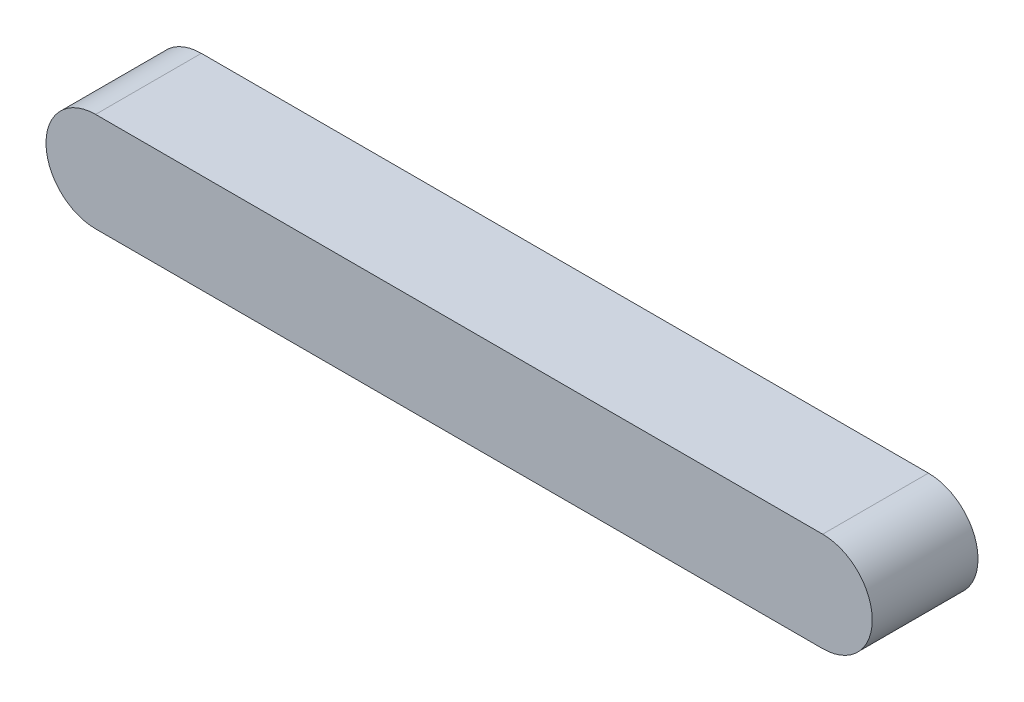
ISO-10303-21;
HEADER;
FILE_DESCRIPTION(('STEP AP214'),'2;1');
FILE_NAME('part.step','',(''),(''),'','','');
FILE_SCHEMA(('AUTOMOTIVE_DESIGN { 1 0 10303 214 1 1 1 1 }'));
ENDSEC;
DATA;
#1=APPLICATION_CONTEXT('core data for automotive mechanical design processes');
#2=APPLICATION_PROTOCOL_DEFINITION('international standard','automotive_design',2000,#1);
#3=PRODUCT_CONTEXT('',#1,'mechanical');
#4=PRODUCT('Part','Part','',(#3));
#5=PRODUCT_RELATED_PRODUCT_CATEGORY('part','',(#4));
#6=PRODUCT_DEFINITION_FORMATION('','',#4);
#7=PRODUCT_DEFINITION_CONTEXT('part definition',#1,'design');
#8=PRODUCT_DEFINITION('design','',#6,#7);
#9=PRODUCT_DEFINITION_SHAPE('','',#8);
#10=(LENGTH_UNIT() NAMED_UNIT(*) SI_UNIT(.MILLI.,.METRE.));
#11=(NAMED_UNIT(*) PLANE_ANGLE_UNIT() SI_UNIT($,.RADIAN.));
#12=(NAMED_UNIT(*) SI_UNIT($,.STERADIAN.) SOLID_ANGLE_UNIT());
#13=UNCERTAINTY_MEASURE_WITH_UNIT(LENGTH_MEASURE(1.E-05),#10,'distance_accuracy_value','');
#14=(GEOMETRIC_REPRESENTATION_CONTEXT(3) GLOBAL_UNCERTAINTY_ASSIGNED_CONTEXT((#13)) GLOBAL_UNIT_ASSIGNED_CONTEXT((#10,
#11,#12)) REPRESENTATION_CONTEXT('',''));
#15=CARTESIAN_POINT('',(0.,0.,0.));
#16=DIRECTION('',(0.,0.,1.));
#17=DIRECTION('',(1.,0.,0.));
#18=AXIS2_PLACEMENT_3D('',#15,#16,#17);
#19=CARTESIAN_POINT('',(0.,0.,3.2));
#20=DIRECTION('',(0.,0.,-1.));
#21=DIRECTION('',(-1.,0.,0.));
#22=AXIS2_PLACEMENT_3D('',#19,#20,#21);
#23=CYLINDRICAL_SURFACE('',#22,1.5);
#24=CARTESIAN_POINT('',(0.,0.,0.));
#25=DIRECTION('',(0.,0.,1.));
#26=DIRECTION('',(1.,0.,0.));
#27=AXIS2_PLACEMENT_3D('',#24,#25,#26);
#28=CIRCLE('',#27,1.5);
#29=CARTESIAN_POINT('',(0.,1.5,0.));
#30=VERTEX_POINT('',#29);
#31=CARTESIAN_POINT('',(0.,-1.5,0.));
#32=VERTEX_POINT('',#31);
#33=EDGE_CURVE('E98',#30,#32,#28,.T.);
#34=ORIENTED_EDGE('',*,*,#33,.T.);
#35=DIRECTION('',(0.,0.,-1.));
#36=VECTOR('',#35,1.);
#37=CARTESIAN_POINT('',(0.,-1.5,3.2));
#38=LINE('',#37,#36);
#39=CARTESIAN_POINT('',(0.,-1.5,3.2));
#40=VERTEX_POINT('',#39);
#41=EDGE_CURVE('E11',#40,#32,#38,.T.);
#42=ORIENTED_EDGE('',*,*,#41,.F.);
#43=CARTESIAN_POINT('',(0.,0.,3.2));
#44=DIRECTION('',(0.,0.,1.));
#45=DIRECTION('',(1.,0.,0.));
#46=AXIS2_PLACEMENT_3D('',#43,#44,#45);
#47=CIRCLE('',#46,1.5);
#48=CARTESIAN_POINT('',(0.,1.5,3.2));
#49=VERTEX_POINT('',#48);
#50=EDGE_CURVE('E86',#49,#40,#47,.T.);
#51=ORIENTED_EDGE('',*,*,#50,.F.);
#52=DIRECTION('',(0.,0.,-1.));
#53=VECTOR('',#52,1.);
#54=CARTESIAN_POINT('',(0.,1.5,3.2));
#55=LINE('',#54,#53);
#56=EDGE_CURVE('E94',#49,#30,#55,.T.);
#57=ORIENTED_EDGE('',*,*,#56,.T.);
#58=EDGE_LOOP('',(#34,#42,#51,#57));
#59=FACE_BOUND('',#58,.T.);
#60=ADVANCED_FACE('F35',(#59),#23,.T.);
#61=CARTESIAN_POINT('',(0.,-1.5,3.2));
#62=DIRECTION('',(0.,1.,0.));
#63=DIRECTION('',(0.,0.,1.));
#64=AXIS2_PLACEMENT_3D('',#61,#62,#63);
#65=PLANE('',#64);
#66=DIRECTION('',(1.,0.,0.));
#67=VECTOR('',#66,1.);
#68=CARTESIAN_POINT('',(0.,-1.5,0.));
#69=LINE('',#68,#67);
#70=CARTESIAN_POINT('',(22.,-1.5,0.));
#71=VERTEX_POINT('',#70);
#72=EDGE_CURVE('E90',#32,#71,#69,.T.);
#73=ORIENTED_EDGE('',*,*,#72,.T.);
#74=DIRECTION('',(0.,0.,-1.));
#75=VECTOR('',#74,1.);
#76=CARTESIAN_POINT('',(22.,-1.5,3.2));
#77=LINE('',#76,#75);
#78=CARTESIAN_POINT('',(22.,-1.5,3.2));
#79=VERTEX_POINT('',#78);
#80=EDGE_CURVE('E43',#79,#71,#77,.T.);
#81=ORIENTED_EDGE('',*,*,#80,.F.);
#82=DIRECTION('',(1.,0.,0.));
#83=VECTOR('',#82,1.);
#84=CARTESIAN_POINT('',(0.,-1.5,3.2));
#85=LINE('',#84,#83);
#86=EDGE_CURVE('E81',#40,#79,#85,.T.);
#87=ORIENTED_EDGE('',*,*,#86,.F.);
#88=ORIENTED_EDGE('',*,*,#41,.T.);
#89=EDGE_LOOP('',(#73,#81,#87,#88));
#90=FACE_BOUND('',#89,.T.);
#91=ADVANCED_FACE('F89',(#90),#65,.F.);
#92=CARTESIAN_POINT('',(22.,0.,3.2));
#93=DIRECTION('',(0.,0.,-1.));
#94=DIRECTION('',(-1.,0.,0.));
#95=AXIS2_PLACEMENT_3D('',#92,#93,#94);
#96=CYLINDRICAL_SURFACE('',#95,1.5);
#97=CARTESIAN_POINT('',(22.,0.,0.));
#98=DIRECTION('',(0.,0.,1.));
#99=DIRECTION('',(1.,0.,0.));
#100=AXIS2_PLACEMENT_3D('',#97,#98,#99);
#101=CIRCLE('',#100,1.5);
#102=CARTESIAN_POINT('',(22.,1.5,0.));
#103=VERTEX_POINT('',#102);
#104=EDGE_CURVE('E68',#71,#103,#101,.T.);
#105=ORIENTED_EDGE('',*,*,#104,.T.);
#106=DIRECTION('',(0.,0.,-1.));
#107=VECTOR('',#106,1.);
#108=CARTESIAN_POINT('',(22.,1.5,3.2));
#109=LINE('',#108,#107);
#110=CARTESIAN_POINT('',(22.,1.5,3.2));
#111=VERTEX_POINT('',#110);
#112=EDGE_CURVE('E91',#111,#103,#109,.T.);
#113=ORIENTED_EDGE('',*,*,#112,.F.);
#114=CARTESIAN_POINT('',(22.,0.,3.2));
#115=DIRECTION('',(0.,0.,1.));
#116=DIRECTION('',(1.,0.,0.));
#117=AXIS2_PLACEMENT_3D('',#114,#115,#116);
#118=CIRCLE('',#117,1.5);
#119=EDGE_CURVE('E84',#79,#111,#118,.T.);
#120=ORIENTED_EDGE('',*,*,#119,.F.);
#121=ORIENTED_EDGE('',*,*,#80,.T.);
#122=EDGE_LOOP('',(#105,#113,#120,#121));
#123=FACE_BOUND('',#122,.T.);
#124=ADVANCED_FACE('F92',(#123),#96,.T.);
#125=CARTESIAN_POINT('',(0.,1.5,3.2));
#126=DIRECTION('',(0.,-1.,0.));
#127=DIRECTION('',(0.,0.,-1.));
#128=AXIS2_PLACEMENT_3D('',#125,#126,#127);
#129=PLANE('',#128);
#130=DIRECTION('',(-1.,0.,0.));
#131=VECTOR('',#130,1.);
#132=CARTESIAN_POINT('',(0.,1.5,0.));
#133=LINE('',#132,#131);
#134=EDGE_CURVE('E74',#103,#30,#133,.T.);
#135=ORIENTED_EDGE('',*,*,#134,.T.);
#136=ORIENTED_EDGE('',*,*,#56,.F.);
#137=DIRECTION('',(-1.,0.,0.));
#138=VECTOR('',#137,1.);
#139=CARTESIAN_POINT('',(0.,1.5,3.2));
#140=LINE('',#139,#138);
#141=EDGE_CURVE('E51',#111,#49,#140,.T.);
#142=ORIENTED_EDGE('',*,*,#141,.F.);
#143=ORIENTED_EDGE('',*,*,#112,.T.);
#144=EDGE_LOOP('',(#135,#136,#142,#143));
#145=FACE_BOUND('',#144,.T.);
#146=ADVANCED_FACE('F105',(#145),#129,.F.);
#147=CARTESIAN_POINT('',(0.,0.,3.2));
#148=DIRECTION('',(0.,0.,1.));
#149=DIRECTION('',(1.,0.,0.));
#150=AXIS2_PLACEMENT_3D('',#147,#148,#149);
#151=PLANE('',#150);
#152=ORIENTED_EDGE('',*,*,#50,.T.);
#153=ORIENTED_EDGE('',*,*,#86,.T.);
#154=ORIENTED_EDGE('',*,*,#119,.T.);
#155=ORIENTED_EDGE('',*,*,#141,.T.);
#156=EDGE_LOOP('',(#152,#153,#154,#155));
#157=FACE_BOUND('',#156,.T.);
#158=ADVANCED_FACE('F82',(#157),#151,.T.);
#159=CARTESIAN_POINT('',(0.,0.,0.));
#160=DIRECTION('',(0.,0.,1.));
#161=DIRECTION('',(1.,0.,0.));
#162=AXIS2_PLACEMENT_3D('',#159,#160,#161);
#163=PLANE('',#162);
#164=ORIENTED_EDGE('',*,*,#33,.F.);
#165=ORIENTED_EDGE('',*,*,#134,.F.);
#166=ORIENTED_EDGE('',*,*,#104,.F.);
#167=ORIENTED_EDGE('',*,*,#72,.F.);
#168=EDGE_LOOP('',(#164,#165,#166,#167));
#169=FACE_BOUND('',#168,.T.);
#170=ADVANCED_FACE('F108',(#169),#163,.F.);
#171=CLOSED_SHELL('',(#60,#91,#124,#146,#158,#170));
#172=MANIFOLD_SOLID_BREP('B2',#171);
#173=ADVANCED_BREP_SHAPE_REPRESENTATION('',(#18,#172),#14);
#174=SHAPE_DEFINITION_REPRESENTATION(#9,#173);
ENDSEC;
END-ISO-10303-21;
